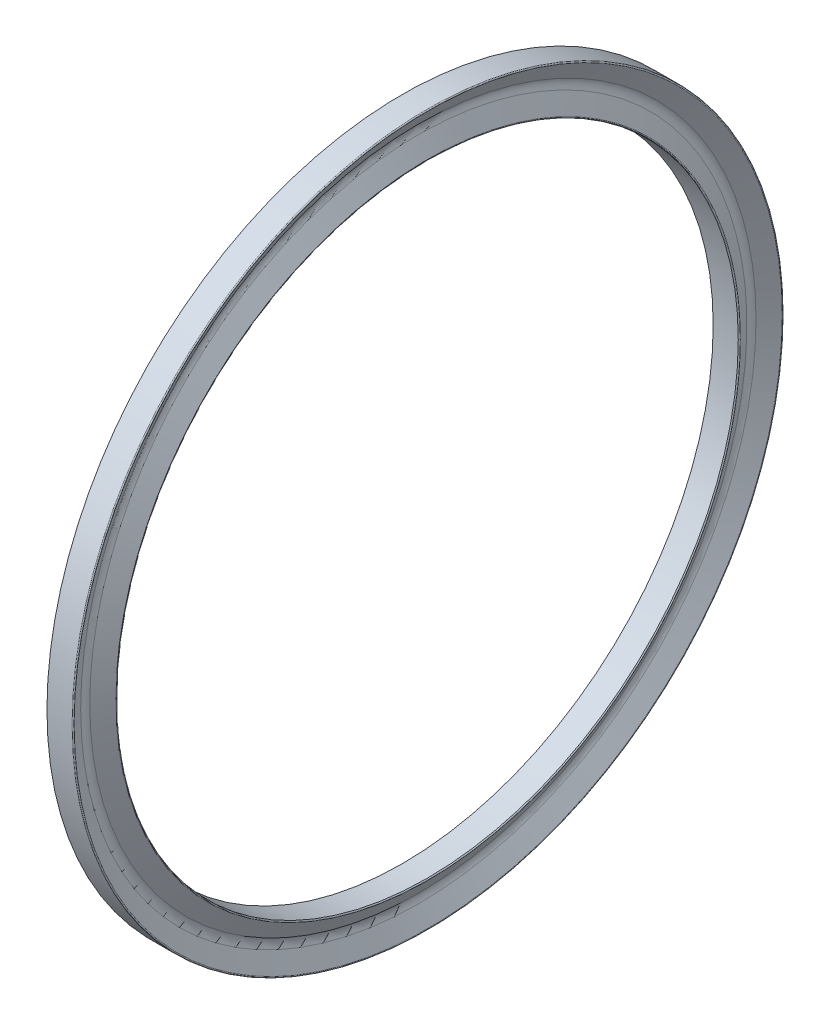
ISO-10303-21;
HEADER;
FILE_DESCRIPTION(('STEP AP214'),'2;1');
FILE_NAME('part.step','',(''),(''),'','','');
FILE_SCHEMA(('AUTOMOTIVE_DESIGN { 1 0 10303 214 1 1 1 1 }'));
ENDSEC;
DATA;
#1=APPLICATION_CONTEXT('core data for automotive mechanical design processes');
#2=APPLICATION_PROTOCOL_DEFINITION('international standard','automotive_design',2000,#1);
#3=PRODUCT_CONTEXT('',#1,'mechanical');
#4=PRODUCT('Part','Part','',(#3));
#5=PRODUCT_RELATED_PRODUCT_CATEGORY('part','',(#4));
#6=PRODUCT_DEFINITION_FORMATION('','',#4);
#7=PRODUCT_DEFINITION_CONTEXT('part definition',#1,'design');
#8=PRODUCT_DEFINITION('design','',#6,#7);
#9=PRODUCT_DEFINITION_SHAPE('','',#8);
#10=(LENGTH_UNIT() NAMED_UNIT(*) SI_UNIT(.MILLI.,.METRE.));
#11=(NAMED_UNIT(*) PLANE_ANGLE_UNIT() SI_UNIT($,.RADIAN.));
#12=(NAMED_UNIT(*) SI_UNIT($,.STERADIAN.) SOLID_ANGLE_UNIT());
#13=UNCERTAINTY_MEASURE_WITH_UNIT(LENGTH_MEASURE(1.E-05),#10,'distance_accuracy_value','');
#14=(GEOMETRIC_REPRESENTATION_CONTEXT(3) GLOBAL_UNCERTAINTY_ASSIGNED_CONTEXT((#13)) GLOBAL_UNIT_ASSIGNED_CONTEXT((#10,
#11,#12)) REPRESENTATION_CONTEXT('',''));
#15=CARTESIAN_POINT('',(0.,0.,0.));
#16=DIRECTION('',(0.,0.,1.));
#17=DIRECTION('',(1.,0.,0.));
#18=AXIS2_PLACEMENT_3D('',#15,#16,#17);
#19=CARTESIAN_POINT('',(-22.4154049753318,-40.,0.));
#20=DIRECTION('',(-1.,0.,0.));
#21=DIRECTION('',(0.,0.,1.));
#22=AXIS2_PLACEMENT_3D('',#19,#20,#21);
#23=PLANE('',#22);
#24=CARTESIAN_POINT('',(-22.4154049753318,0.,0.));
#25=DIRECTION('',(-1.,0.,0.));
#26=DIRECTION('',(0.,0.,1.));
#27=AXIS2_PLACEMENT_3D('',#24,#25,#26);
#28=CIRCLE('',#27,40.);
#29=CARTESIAN_POINT('',(-22.4154049753318,0.,40.));
#30=VERTEX_POINT('',#29);
#31=EDGE_CURVE('E72',#30,#30,#28,.T.);
#32=ORIENTED_EDGE('',*,*,#31,.T.);
#33=EDGE_LOOP('',(#32));
#34=FACE_BOUND('',#33,.T.);
#35=CARTESIAN_POINT('',(-22.4154049753318,0.,0.));
#36=DIRECTION('',(-1.,0.,0.));
#37=DIRECTION('',(0.,0.,1.));
#38=AXIS2_PLACEMENT_3D('',#35,#36,#37);
#39=CIRCLE('',#38,35.);
#40=CARTESIAN_POINT('',(-22.4154049753318,0.,35.));
#41=VERTEX_POINT('',#40);
#42=EDGE_CURVE('E10',#41,#41,#39,.T.);
#43=ORIENTED_EDGE('',*,*,#42,.F.);
#44=EDGE_LOOP('',(#43));
#45=FACE_BOUND('',#44,.T.);
#46=ADVANCED_FACE('F34',(#34,#45),#23,.T.);
#47=CARTESIAN_POINT('',(-74.7572504991172,0.,0.));
#48=DIRECTION('',(-1.,0.,0.));
#49=DIRECTION('',(0.,0.,1.));
#50=AXIS2_PLACEMENT_3D('',#47,#48,#49);
#51=CYLINDRICAL_SURFACE('',#50,35.);
#52=ORIENTED_EDGE('',*,*,#42,.T.);
#53=EDGE_LOOP('',(#52));
#54=FACE_BOUND('',#53,.T.);
#55=CARTESIAN_POINT('',(-19.5920240132287,0.,0.));
#56=DIRECTION('',(-1.,0.,0.));
#57=DIRECTION('',(0.,0.,1.));
#58=AXIS2_PLACEMENT_3D('',#55,#56,#57);
#59=CIRCLE('',#58,35.);
#60=CARTESIAN_POINT('',(-19.5920240132287,0.,35.));
#61=VERTEX_POINT('',#60);
#62=EDGE_CURVE('E41',#61,#61,#59,.T.);
#63=ORIENTED_EDGE('',*,*,#62,.F.);
#64=EDGE_LOOP('',(#63));
#65=FACE_BOUND('',#64,.T.);
#66=ADVANCED_FACE('F92',(#54,#65),#51,.F.);
#67=CARTESIAN_POINT('',(-19.5920240132287,0.,0.));
#68=DIRECTION('',(-1.,0.,0.));
#69=DIRECTION('',(0.,0.,1.));
#70=AXIS2_PLACEMENT_3D('',#67,#68,#69);
#71=TOROIDAL_SURFACE('',#70,35.1,0.1);
#72=ORIENTED_EDGE('',*,*,#62,.T.);
#73=EDGE_LOOP('',(#72));
#74=FACE_BOUND('',#73,.T.);
#75=CARTESIAN_POINT('',(-19.5062747206574,0.,0.));
#76=DIRECTION('',(-1.,0.,0.));
#77=DIRECTION('',(0.,0.,1.));
#78=AXIS2_PLACEMENT_3D('',#75,#76,#77);
#79=CIRCLE('',#78,35.1514495755428);
#80=CARTESIAN_POINT('',(-19.5062747206574,0.,35.1514495755428));
#81=VERTEX_POINT('',#80);
#82=EDGE_CURVE('E48',#81,#81,#79,.T.);
#83=ORIENTED_EDGE('',*,*,#82,.F.);
#84=EDGE_LOOP('',(#83));
#85=FACE_BOUND('',#84,.T.);
#86=ADVANCED_FACE('F96',(#74,#85),#71,.T.);
#87=CARTESIAN_POINT('',(-20.6067075220752,0.,0.));
#88=DIRECTION('',(-1.,0.,0.));
#89=DIRECTION('',(0.,0.,1.));
#90=AXIS2_PLACEMENT_3D('',#87,#88,#89);
#91=CONICAL_SURFACE('',#90,36.9855042445725,1.03037682652432);
#92=ORIENTED_EDGE('',*,*,#82,.T.);
#93=EDGE_LOOP('',(#92));
#94=FACE_BOUND('',#93,.T.);
#95=CARTESIAN_POINT('',(-20.6067075220752,0.,0.));
#96=DIRECTION('',(-1.,0.,0.));
#97=DIRECTION('',(0.,0.,1.));
#98=AXIS2_PLACEMENT_3D('',#95,#96,#97);
#99=CIRCLE('',#98,36.9855042445725);
#100=CARTESIAN_POINT('',(-20.6067075220752,0.,36.9855042445725));
#101=VERTEX_POINT('',#100);
#102=EDGE_CURVE('E54',#101,#101,#99,.T.);
#103=ORIENTED_EDGE('',*,*,#102,.F.);
#104=EDGE_LOOP('',(#103));
#105=FACE_BOUND('',#104,.T.);
#106=ADVANCED_FACE('F100',(#94,#105),#91,.T.);
#107=CARTESIAN_POINT('',(-19.7492145963627,0.,0.));
#108=DIRECTION('',(-1.,0.,0.));
#109=DIRECTION('',(0.,0.,1.));
#110=AXIS2_PLACEMENT_3D('',#107,#108,#109);
#111=TOROIDAL_SURFACE('',#110,37.5,0.999999999999996);
#112=ORIENTED_EDGE('',*,*,#102,.T.);
#113=EDGE_LOOP('',(#112));
#114=FACE_BOUND('',#113,.T.);
#115=CARTESIAN_POINT('',(-20.6067075220752,0.,0.));
#116=DIRECTION('',(-1.,0.,0.));
#117=DIRECTION('',(0.,0.,1.));
#118=AXIS2_PLACEMENT_3D('',#115,#116,#117);
#119=CIRCLE('',#118,38.0144957554275);
#120=CARTESIAN_POINT('',(-20.6067075220752,0.,38.0144957554275));
#121=VERTEX_POINT('',#120);
#122=EDGE_CURVE('E60',#121,#121,#119,.T.);
#123=ORIENTED_EDGE('',*,*,#122,.F.);
#124=EDGE_LOOP('',(#123));
#125=FACE_BOUND('',#124,.T.);
#126=ADVANCED_FACE('F106',(#114,#125),#111,.F.);
#127=CARTESIAN_POINT('',(-19.5062747206574,0.,0.));
#128=DIRECTION('',(1.,0.,0.));
#129=DIRECTION('',(0.,0.,-1.));
#130=AXIS2_PLACEMENT_3D('',#127,#128,#129);
#131=CONICAL_SURFACE('',#130,39.8485504244573,1.03037682652432);
#132=ORIENTED_EDGE('',*,*,#122,.T.);
#133=EDGE_LOOP('',(#132));
#134=FACE_BOUND('',#133,.T.);
#135=CARTESIAN_POINT('',(-19.5062747206574,0.,0.));
#136=DIRECTION('',(-1.,0.,0.));
#137=DIRECTION('',(0.,0.,1.));
#138=AXIS2_PLACEMENT_3D('',#135,#136,#137);
#139=CIRCLE('',#138,39.8485504244573);
#140=CARTESIAN_POINT('',(-19.5062747206574,0.,39.8485504244573));
#141=VERTEX_POINT('',#140);
#142=EDGE_CURVE('E64',#141,#141,#139,.T.);
#143=ORIENTED_EDGE('',*,*,#142,.F.);
#144=EDGE_LOOP('',(#143));
#145=FACE_BOUND('',#144,.T.);
#146=ADVANCED_FACE('F88',(#134,#145),#131,.F.);
#147=CARTESIAN_POINT('',(-19.5920240132287,0.,0.));
#148=DIRECTION('',(-1.,0.,0.));
#149=DIRECTION('',(0.,0.,1.));
#150=AXIS2_PLACEMENT_3D('',#147,#148,#149);
#151=TOROIDAL_SURFACE('',#150,39.9,0.0999999999999988);
#152=ORIENTED_EDGE('',*,*,#142,.T.);
#153=EDGE_LOOP('',(#152));
#154=FACE_BOUND('',#153,.T.);
#155=CARTESIAN_POINT('',(-19.5920240132287,0.,0.));
#156=DIRECTION('',(-1.,0.,0.));
#157=DIRECTION('',(0.,0.,1.));
#158=AXIS2_PLACEMENT_3D('',#155,#156,#157);
#159=CIRCLE('',#158,40.);
#160=CARTESIAN_POINT('',(-19.5920240132287,0.,40.));
#161=VERTEX_POINT('',#160);
#162=EDGE_CURVE('E68',#161,#161,#159,.T.);
#163=ORIENTED_EDGE('',*,*,#162,.F.);
#164=EDGE_LOOP('',(#163));
#165=FACE_BOUND('',#164,.T.);
#166=ADVANCED_FACE('F82',(#154,#165),#151,.T.);
#167=CARTESIAN_POINT('',(-74.7572504991172,0.,0.));
#168=DIRECTION('',(-1.,0.,0.));
#169=DIRECTION('',(0.,0.,1.));
#170=AXIS2_PLACEMENT_3D('',#167,#168,#169);
#171=CYLINDRICAL_SURFACE('',#170,40.);
#172=ORIENTED_EDGE('',*,*,#162,.T.);
#173=EDGE_LOOP('',(#172));
#174=FACE_BOUND('',#173,.T.);
#175=ORIENTED_EDGE('',*,*,#31,.F.);
#176=EDGE_LOOP('',(#175));
#177=FACE_BOUND('',#176,.T.);
#178=ADVANCED_FACE('F80',(#174,#177),#171,.T.);
#179=CLOSED_SHELL('',(#46,#66,#86,#106,#126,#146,#166,#178));
#180=MANIFOLD_SOLID_BREP('B2',#179);
#181=ADVANCED_BREP_SHAPE_REPRESENTATION('',(#18,#180),#14);
#182=SHAPE_DEFINITION_REPRESENTATION(#9,#181);
ENDSEC;
END-ISO-10303-21;
